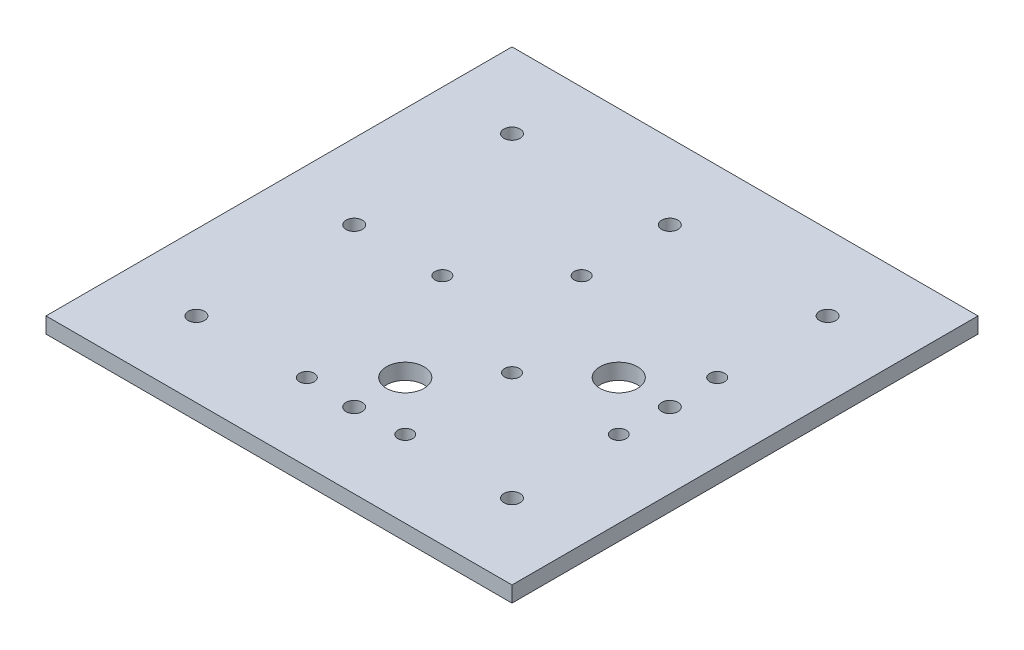
ISO-10303-21;
HEADER;
FILE_DESCRIPTION(('STEP AP214'),'2;1');
FILE_NAME('part.step','',(''),(''),'','','');
FILE_SCHEMA(('AUTOMOTIVE_DESIGN { 1 0 10303 214 1 1 1 1 }'));
ENDSEC;
DATA;
#1=APPLICATION_CONTEXT('core data for automotive mechanical design processes');
#2=APPLICATION_PROTOCOL_DEFINITION('international standard','automotive_design',2000,#1);
#3=PRODUCT_CONTEXT('',#1,'mechanical');
#4=PRODUCT('Part','Part','',(#3));
#5=PRODUCT_RELATED_PRODUCT_CATEGORY('part','',(#4));
#6=PRODUCT_DEFINITION_FORMATION('','',#4);
#7=PRODUCT_DEFINITION_CONTEXT('part definition',#1,'design');
#8=PRODUCT_DEFINITION('design','',#6,#7);
#9=PRODUCT_DEFINITION_SHAPE('','',#8);
#10=(LENGTH_UNIT() NAMED_UNIT(*) SI_UNIT(.MILLI.,.METRE.));
#11=(NAMED_UNIT(*) PLANE_ANGLE_UNIT() SI_UNIT($,.RADIAN.));
#12=(NAMED_UNIT(*) SI_UNIT($,.STERADIAN.) SOLID_ANGLE_UNIT());
#13=UNCERTAINTY_MEASURE_WITH_UNIT(LENGTH_MEASURE(1.E-05),#10,'distance_accuracy_value','');
#14=(GEOMETRIC_REPRESENTATION_CONTEXT(3) GLOBAL_UNCERTAINTY_ASSIGNED_CONTEXT((#13)) GLOBAL_UNIT_ASSIGNED_CONTEXT((#10,
#11,#12)) REPRESENTATION_CONTEXT('',''));
#15=CARTESIAN_POINT('',(0.,0.,0.));
#16=DIRECTION('',(0.,0.,1.));
#17=DIRECTION('',(1.,0.,0.));
#18=AXIS2_PLACEMENT_3D('',#15,#16,#17);
#19=CARTESIAN_POINT('',(0.,-3.4,0.));
#20=DIRECTION('',(0.,-1.,0.));
#21=DIRECTION('',(0.,0.,-1.));
#22=AXIS2_PLACEMENT_3D('',#19,#20,#21);
#23=PLANE('',#22);
#24=CARTESIAN_POINT('',(49.,-3.4,-26.));
#25=DIRECTION('',(0.,-1.,0.));
#26=DIRECTION('',(0.,0.,-1.));
#27=AXIS2_PLACEMENT_3D('',#24,#25,#26);
#28=CIRCLE('',#27,4.05);
#29=CARTESIAN_POINT('',(49.,-3.4,-30.05));
#30=VERTEX_POINT('',#29);
#31=EDGE_CURVE('E149',#30,#30,#28,.T.);
#32=ORIENTED_EDGE('',*,*,#31,.F.);
#33=EDGE_LOOP('',(#32));
#34=FACE_BOUND('',#33,.T.);
#35=CARTESIAN_POINT('',(38.3933982822018,-3.4,-15.3933982822018));
#36=DIRECTION('',(0.,-1.,0.));
#37=DIRECTION('',(0.,0.,-1.));
#38=AXIS2_PLACEMENT_3D('',#35,#36,#37);
#39=CIRCLE('',#38,1.6);
#40=CARTESIAN_POINT('',(38.3933982822018,-3.4,-16.9933982822018));
#41=VERTEX_POINT('',#40);
#42=EDGE_CURVE('E137',#41,#41,#39,.T.);
#43=ORIENTED_EDGE('',*,*,#42,.F.);
#44=EDGE_LOOP('',(#43));
#45=FACE_BOUND('',#44,.T.);
#46=CARTESIAN_POINT('',(59.6066017177982,-3.4,-15.3933982822018));
#47=DIRECTION('',(0.,-1.,0.));
#48=DIRECTION('',(0.,0.,-1.));
#49=AXIS2_PLACEMENT_3D('',#46,#47,#48);
#50=CIRCLE('',#49,1.6);
#51=CARTESIAN_POINT('',(59.6066017177982,-3.4,-16.9933982822018));
#52=VERTEX_POINT('',#51);
#53=EDGE_CURVE('E134',#52,#52,#50,.T.);
#54=ORIENTED_EDGE('',*,*,#53,.F.);
#55=EDGE_LOOP('',(#54));
#56=FACE_BOUND('',#55,.T.);
#57=CARTESIAN_POINT('',(34.,-3.4,-49.));
#58=DIRECTION('',(0.,-1.,0.));
#59=DIRECTION('',(0.,0.,-1.));
#60=AXIS2_PLACEMENT_3D('',#57,#58,#59);
#61=CIRCLE('',#60,1.6);
#62=CARTESIAN_POINT('',(34.,-3.4,-50.6));
#63=VERTEX_POINT('',#62);
#64=EDGE_CURVE('E131',#63,#63,#61,.T.);
#65=ORIENTED_EDGE('',*,*,#64,.F.);
#66=EDGE_LOOP('',(#65));
#67=FACE_BOUND('',#66,.T.);
#68=CARTESIAN_POINT('',(72.,-3.4,-49.));
#69=DIRECTION('',(0.,-1.,0.));
#70=DIRECTION('',(0.,0.,-1.));
#71=AXIS2_PLACEMENT_3D('',#68,#69,#70);
#72=CIRCLE('',#71,4.04999999999999);
#73=CARTESIAN_POINT('',(72.,-3.4,-53.05));
#74=VERTEX_POINT('',#73);
#75=EDGE_CURVE('E127',#74,#74,#72,.T.);
#76=ORIENTED_EDGE('',*,*,#75,.F.);
#77=EDGE_LOOP('',(#76));
#78=FACE_BOUND('',#77,.T.);
#79=CARTESIAN_POINT('',(49.,-3.4,-64.));
#80=DIRECTION('',(0.,-1.,0.));
#81=DIRECTION('',(0.,0.,-1.));
#82=AXIS2_PLACEMENT_3D('',#79,#80,#81);
#83=CIRCLE('',#82,1.59999999999998);
#84=CARTESIAN_POINT('',(49.,-3.4,-65.6));
#85=VERTEX_POINT('',#84);
#86=EDGE_CURVE('E123',#85,#85,#83,.T.);
#87=ORIENTED_EDGE('',*,*,#86,.F.);
#88=EDGE_LOOP('',(#87));
#89=FACE_BOUND('',#88,.T.);
#90=CARTESIAN_POINT('',(82.6066017177982,-3.4,-59.6066017177982));
#91=DIRECTION('',(0.,-1.,0.));
#92=DIRECTION('',(0.,0.,-1.));
#93=AXIS2_PLACEMENT_3D('',#90,#91,#92);
#94=CIRCLE('',#93,1.6);
#95=CARTESIAN_POINT('',(82.6066017177982,-3.4,-61.2066017177982));
#96=VERTEX_POINT('',#95);
#97=EDGE_CURVE('E119',#96,#96,#94,.T.);
#98=ORIENTED_EDGE('',*,*,#97,.F.);
#99=EDGE_LOOP('',(#98));
#100=FACE_BOUND('',#99,.T.);
#101=CARTESIAN_POINT('',(82.6066017177982,-3.4,-38.3933982822018));
#102=DIRECTION('',(0.,-1.,0.));
#103=DIRECTION('',(0.,0.,-1.));
#104=AXIS2_PLACEMENT_3D('',#101,#102,#103);
#105=CIRCLE('',#104,1.60000000000001);
#106=CARTESIAN_POINT('',(82.6066017177982,-3.4,-39.9933982822018));
#107=VERTEX_POINT('',#106);
#108=EDGE_CURVE('E115',#107,#107,#105,.T.);
#109=ORIENTED_EDGE('',*,*,#108,.F.);
#110=EDGE_LOOP('',(#109));
#111=FACE_BOUND('',#110,.T.);
#112=CARTESIAN_POINT('',(59.6066017177982,-3.4,-38.3933982822018));
#113=DIRECTION('',(0.,-1.,0.));
#114=DIRECTION('',(0.,0.,-1.));
#115=AXIS2_PLACEMENT_3D('',#112,#113,#114);
#116=CIRCLE('',#115,1.6);
#117=CARTESIAN_POINT('',(59.6066017177982,-3.4,-39.9933982822018));
#118=VERTEX_POINT('',#117);
#119=EDGE_CURVE('E111',#118,#118,#116,.T.);
#120=ORIENTED_EDGE('',*,*,#119,.F.);
#121=EDGE_LOOP('',(#120));
#122=FACE_BOUND('',#121,.T.);
#123=CARTESIAN_POINT('',(83.0000000000007,-3.4,-15.));
#124=DIRECTION('',(0.,-1.,0.));
#125=DIRECTION('',(0.,0.,-1.));
#126=AXIS2_PLACEMENT_3D('',#123,#124,#125);
#127=CIRCLE('',#126,1.75);
#128=CARTESIAN_POINT('',(83.0000000000007,-3.4,-16.75));
#129=VERTEX_POINT('',#128);
#130=EDGE_CURVE('E159',#129,#129,#127,.T.);
#131=ORIENTED_EDGE('',*,*,#130,.F.);
#132=EDGE_LOOP('',(#131));
#133=FACE_BOUND('',#132,.T.);
#134=CARTESIAN_POINT('',(83.,-3.4,-83.));
#135=DIRECTION('',(0.,-1.,0.));
#136=DIRECTION('',(0.,0.,-1.));
#137=AXIS2_PLACEMENT_3D('',#134,#135,#136);
#138=CIRCLE('',#137,1.75);
#139=CARTESIAN_POINT('',(83.,-3.4,-84.75));
#140=VERTEX_POINT('',#139);
#141=EDGE_CURVE('E171',#140,#140,#138,.T.);
#142=ORIENTED_EDGE('',*,*,#141,.F.);
#143=EDGE_LOOP('',(#142));
#144=FACE_BOUND('',#143,.T.);
#145=CARTESIAN_POINT('',(15.,-3.4,-83.));
#146=DIRECTION('',(0.,-1.,0.));
#147=DIRECTION('',(0.,0.,-1.));
#148=AXIS2_PLACEMENT_3D('',#145,#146,#147);
#149=CIRCLE('',#148,1.75);
#150=CARTESIAN_POINT('',(15.,-3.4,-84.75));
#151=VERTEX_POINT('',#150);
#152=EDGE_CURVE('E183',#151,#151,#149,.T.);
#153=ORIENTED_EDGE('',*,*,#152,.F.);
#154=EDGE_LOOP('',(#153));
#155=FACE_BOUND('',#154,.T.);
#156=CARTESIAN_POINT('',(15.0000000000007,-3.4,-15.));
#157=DIRECTION('',(0.,-1.,0.));
#158=DIRECTION('',(0.,0.,-1.));
#159=AXIS2_PLACEMENT_3D('',#156,#157,#158);
#160=CIRCLE('',#159,1.75);
#161=CARTESIAN_POINT('',(15.0000000000007,-3.4,-16.75));
#162=VERTEX_POINT('',#161);
#163=EDGE_CURVE('E102',#162,#162,#160,.T.);
#164=ORIENTED_EDGE('',*,*,#163,.F.);
#165=EDGE_LOOP('',(#164));
#166=FACE_BOUND('',#165,.T.);
#167=DIRECTION('',(-1.,0.,0.));
#168=VECTOR('',#167,1.);
#169=CARTESIAN_POINT('',(99.2,-3.4,1.2));
#170=LINE('',#169,#168);
#171=CARTESIAN_POINT('',(99.2,-3.4,1.2));
#172=VERTEX_POINT('',#171);
#173=CARTESIAN_POINT('',(-1.2,-3.4,1.2));
#174=VERTEX_POINT('',#173);
#175=EDGE_CURVE('E86',#172,#174,#170,.T.);
#176=ORIENTED_EDGE('',*,*,#175,.T.);
#177=DIRECTION('',(0.,0.,-1.));
#178=VECTOR('',#177,1.);
#179=CARTESIAN_POINT('',(-1.2,-3.4,1.2));
#180=LINE('',#179,#178);
#181=CARTESIAN_POINT('',(-1.20000000000003,-3.4,-99.2));
#182=VERTEX_POINT('',#181);
#183=EDGE_CURVE('E81',#174,#182,#180,.T.);
#184=ORIENTED_EDGE('',*,*,#183,.T.);
#185=DIRECTION('',(1.,0.,0.));
#186=VECTOR('',#185,1.);
#187=CARTESIAN_POINT('',(-1.20000000000003,-3.4,-99.2));
#188=LINE('',#187,#186);
#189=CARTESIAN_POINT('',(99.2,-3.4,-99.2));
#190=VERTEX_POINT('',#189);
#191=EDGE_CURVE('E84',#182,#190,#188,.T.);
#192=ORIENTED_EDGE('',*,*,#191,.T.);
#193=DIRECTION('',(0.,0.,1.));
#194=VECTOR('',#193,1.);
#195=CARTESIAN_POINT('',(99.2,-3.4,-99.2));
#196=LINE('',#195,#194);
#197=EDGE_CURVE('E51',#190,#172,#196,.T.);
#198=ORIENTED_EDGE('',*,*,#197,.T.);
#199=EDGE_LOOP('',(#176,#184,#192,#198));
#200=FACE_BOUND('',#199,.T.);
#201=CARTESIAN_POINT('',(15.0000000000004,-3.4,-49.));
#202=DIRECTION('',(0.,-1.,0.));
#203=DIRECTION('',(0.,0.,-1.));
#204=AXIS2_PLACEMENT_3D('',#201,#202,#203);
#205=CIRCLE('',#204,1.75);
#206=CARTESIAN_POINT('',(15.0000000000004,-3.4,-50.75));
#207=VERTEX_POINT('',#206);
#208=EDGE_CURVE('E189',#207,#207,#205,.T.);
#209=ORIENTED_EDGE('',*,*,#208,.F.);
#210=EDGE_LOOP('',(#209));
#211=FACE_BOUND('',#210,.T.);
#212=CARTESIAN_POINT('',(49.,-3.4,-83.));
#213=DIRECTION('',(0.,-1.,0.));
#214=DIRECTION('',(0.,0.,-1.));
#215=AXIS2_PLACEMENT_3D('',#212,#213,#214);
#216=CIRCLE('',#215,1.75);
#217=CARTESIAN_POINT('',(49.,-3.4,-84.75));
#218=VERTEX_POINT('',#217);
#219=EDGE_CURVE('E177',#218,#218,#216,.T.);
#220=ORIENTED_EDGE('',*,*,#219,.F.);
#221=EDGE_LOOP('',(#220));
#222=FACE_BOUND('',#221,.T.);
#223=CARTESIAN_POINT('',(83.0000000000004,-3.4,-49.));
#224=DIRECTION('',(0.,-1.,0.));
#225=DIRECTION('',(0.,0.,-1.));
#226=AXIS2_PLACEMENT_3D('',#223,#224,#225);
#227=CIRCLE('',#226,1.75);
#228=CARTESIAN_POINT('',(83.0000000000004,-3.4,-50.75));
#229=VERTEX_POINT('',#228);
#230=EDGE_CURVE('E165',#229,#229,#227,.T.);
#231=ORIENTED_EDGE('',*,*,#230,.F.);
#232=EDGE_LOOP('',(#231));
#233=FACE_BOUND('',#232,.T.);
#234=CARTESIAN_POINT('',(49.0000000000007,-3.4,-15.));
#235=DIRECTION('',(0.,-1.,0.));
#236=DIRECTION('',(0.,0.,-1.));
#237=AXIS2_PLACEMENT_3D('',#234,#235,#236);
#238=CIRCLE('',#237,1.75);
#239=CARTESIAN_POINT('',(49.0000000000007,-3.4,-16.75));
#240=VERTEX_POINT('',#239);
#241=EDGE_CURVE('E153',#240,#240,#238,.T.);
#242=ORIENTED_EDGE('',*,*,#241,.F.);
#243=EDGE_LOOP('',(#242));
#244=FACE_BOUND('',#243,.T.);
#245=ADVANCED_FACE('F32',(#34,#45,#56,#67,#78,#89,#100,#111,#122,#133,#144,#155,#166,#200,#211,
#222,#233,#244),#23,.T.);
#246=CARTESIAN_POINT('',(0.,0.,0.));
#247=DIRECTION('',(0.,-1.,0.));
#248=DIRECTION('',(0.,0.,-1.));
#249=AXIS2_PLACEMENT_3D('',#246,#247,#248);
#250=PLANE('',#249);
#251=CARTESIAN_POINT('',(49.,0.,-26.));
#252=DIRECTION('',(0.,-1.,0.));
#253=DIRECTION('',(0.,0.,-1.));
#254=AXIS2_PLACEMENT_3D('',#251,#252,#253);
#255=CIRCLE('',#254,4.05);
#256=CARTESIAN_POINT('',(49.,0.,-30.05));
#257=VERTEX_POINT('',#256);
#258=EDGE_CURVE('E36',#257,#257,#255,.T.);
#259=ORIENTED_EDGE('',*,*,#258,.T.);
#260=EDGE_LOOP('',(#259));
#261=FACE_BOUND('',#260,.T.);
#262=CARTESIAN_POINT('',(38.3933982822018,0.,-15.3933982822018));
#263=DIRECTION('',(0.,-1.,0.));
#264=DIRECTION('',(0.,0.,-1.));
#265=AXIS2_PLACEMENT_3D('',#262,#263,#264);
#266=CIRCLE('',#265,1.6);
#267=CARTESIAN_POINT('',(38.3933982822018,0.,-16.9933982822018));
#268=VERTEX_POINT('',#267);
#269=EDGE_CURVE('E135',#268,#268,#266,.T.);
#270=ORIENTED_EDGE('',*,*,#269,.T.);
#271=EDGE_LOOP('',(#270));
#272=FACE_BOUND('',#271,.T.);
#273=CARTESIAN_POINT('',(59.6066017177982,0.,-15.3933982822018));
#274=DIRECTION('',(0.,-1.,0.));
#275=DIRECTION('',(0.,0.,-1.));
#276=AXIS2_PLACEMENT_3D('',#273,#274,#275);
#277=CIRCLE('',#276,1.6);
#278=CARTESIAN_POINT('',(59.6066017177982,0.,-16.9933982822018));
#279=VERTEX_POINT('',#278);
#280=EDGE_CURVE('E132',#279,#279,#277,.T.);
#281=ORIENTED_EDGE('',*,*,#280,.T.);
#282=EDGE_LOOP('',(#281));
#283=FACE_BOUND('',#282,.T.);
#284=CARTESIAN_POINT('',(34.,0.,-49.));
#285=DIRECTION('',(0.,-1.,0.));
#286=DIRECTION('',(0.,0.,-1.));
#287=AXIS2_PLACEMENT_3D('',#284,#285,#286);
#288=CIRCLE('',#287,1.6);
#289=CARTESIAN_POINT('',(34.,0.,-50.6));
#290=VERTEX_POINT('',#289);
#291=EDGE_CURVE('E128',#290,#290,#288,.T.);
#292=ORIENTED_EDGE('',*,*,#291,.T.);
#293=EDGE_LOOP('',(#292));
#294=FACE_BOUND('',#293,.T.);
#295=CARTESIAN_POINT('',(72.,0.,-49.));
#296=DIRECTION('',(0.,-1.,0.));
#297=DIRECTION('',(0.,0.,-1.));
#298=AXIS2_PLACEMENT_3D('',#295,#296,#297);
#299=CIRCLE('',#298,4.04999999999999);
#300=CARTESIAN_POINT('',(72.,0.,-53.05));
#301=VERTEX_POINT('',#300);
#302=EDGE_CURVE('E124',#301,#301,#299,.T.);
#303=ORIENTED_EDGE('',*,*,#302,.T.);
#304=EDGE_LOOP('',(#303));
#305=FACE_BOUND('',#304,.T.);
#306=CARTESIAN_POINT('',(49.,0.,-64.));
#307=DIRECTION('',(0.,-1.,0.));
#308=DIRECTION('',(0.,0.,-1.));
#309=AXIS2_PLACEMENT_3D('',#306,#307,#308);
#310=CIRCLE('',#309,1.59999999999998);
#311=CARTESIAN_POINT('',(49.,0.,-65.6));
#312=VERTEX_POINT('',#311);
#313=EDGE_CURVE('E120',#312,#312,#310,.T.);
#314=ORIENTED_EDGE('',*,*,#313,.T.);
#315=EDGE_LOOP('',(#314));
#316=FACE_BOUND('',#315,.T.);
#317=CARTESIAN_POINT('',(82.6066017177982,0.,-59.6066017177982));
#318=DIRECTION('',(0.,-1.,0.));
#319=DIRECTION('',(0.,0.,-1.));
#320=AXIS2_PLACEMENT_3D('',#317,#318,#319);
#321=CIRCLE('',#320,1.6);
#322=CARTESIAN_POINT('',(82.6066017177982,0.,-61.2066017177982));
#323=VERTEX_POINT('',#322);
#324=EDGE_CURVE('E116',#323,#323,#321,.T.);
#325=ORIENTED_EDGE('',*,*,#324,.T.);
#326=EDGE_LOOP('',(#325));
#327=FACE_BOUND('',#326,.T.);
#328=CARTESIAN_POINT('',(82.6066017177982,0.,-38.3933982822018));
#329=DIRECTION('',(0.,-1.,0.));
#330=DIRECTION('',(0.,0.,-1.));
#331=AXIS2_PLACEMENT_3D('',#328,#329,#330);
#332=CIRCLE('',#331,1.60000000000001);
#333=CARTESIAN_POINT('',(82.6066017177982,0.,-39.9933982822018));
#334=VERTEX_POINT('',#333);
#335=EDGE_CURVE('E112',#334,#334,#332,.T.);
#336=ORIENTED_EDGE('',*,*,#335,.T.);
#337=EDGE_LOOP('',(#336));
#338=FACE_BOUND('',#337,.T.);
#339=CARTESIAN_POINT('',(59.6066017177982,0.,-38.3933982822018));
#340=DIRECTION('',(0.,-1.,0.));
#341=DIRECTION('',(0.,0.,-1.));
#342=AXIS2_PLACEMENT_3D('',#339,#340,#341);
#343=CIRCLE('',#342,1.6);
#344=CARTESIAN_POINT('',(59.6066017177982,0.,-39.9933982822018));
#345=VERTEX_POINT('',#344);
#346=EDGE_CURVE('E108',#345,#345,#343,.T.);
#347=ORIENTED_EDGE('',*,*,#346,.T.);
#348=EDGE_LOOP('',(#347));
#349=FACE_BOUND('',#348,.T.);
#350=CARTESIAN_POINT('',(83.0000000000007,0.,-15.));
#351=DIRECTION('',(0.,-1.,0.));
#352=DIRECTION('',(0.,0.,-1.));
#353=AXIS2_PLACEMENT_3D('',#350,#351,#352);
#354=CIRCLE('',#353,1.75);
#355=CARTESIAN_POINT('',(83.0000000000007,0.,-16.75));
#356=VERTEX_POINT('',#355);
#357=EDGE_CURVE('E156',#356,#356,#354,.T.);
#358=ORIENTED_EDGE('',*,*,#357,.T.);
#359=EDGE_LOOP('',(#358));
#360=FACE_BOUND('',#359,.T.);
#361=CARTESIAN_POINT('',(83.,0.,-83.));
#362=DIRECTION('',(0.,-1.,0.));
#363=DIRECTION('',(0.,0.,-1.));
#364=AXIS2_PLACEMENT_3D('',#361,#362,#363);
#365=CIRCLE('',#364,1.75);
#366=CARTESIAN_POINT('',(83.,0.,-84.75));
#367=VERTEX_POINT('',#366);
#368=EDGE_CURVE('E168',#367,#367,#365,.T.);
#369=ORIENTED_EDGE('',*,*,#368,.T.);
#370=EDGE_LOOP('',(#369));
#371=FACE_BOUND('',#370,.T.);
#372=CARTESIAN_POINT('',(15.,0.,-83.));
#373=DIRECTION('',(0.,-1.,0.));
#374=DIRECTION('',(0.,0.,-1.));
#375=AXIS2_PLACEMENT_3D('',#372,#373,#374);
#376=CIRCLE('',#375,1.75);
#377=CARTESIAN_POINT('',(15.,0.,-84.75));
#378=VERTEX_POINT('',#377);
#379=EDGE_CURVE('E180',#378,#378,#376,.T.);
#380=ORIENTED_EDGE('',*,*,#379,.T.);
#381=EDGE_LOOP('',(#380));
#382=FACE_BOUND('',#381,.T.);
#383=CARTESIAN_POINT('',(15.0000000000007,0.,-15.));
#384=DIRECTION('',(0.,-1.,0.));
#385=DIRECTION('',(0.,0.,-1.));
#386=AXIS2_PLACEMENT_3D('',#383,#384,#385);
#387=CIRCLE('',#386,1.75);
#388=CARTESIAN_POINT('',(15.0000000000007,0.,-16.75));
#389=VERTEX_POINT('',#388);
#390=EDGE_CURVE('E192',#389,#389,#387,.T.);
#391=ORIENTED_EDGE('',*,*,#390,.T.);
#392=EDGE_LOOP('',(#391));
#393=FACE_BOUND('',#392,.T.);
#394=DIRECTION('',(-1.,0.,0.));
#395=VECTOR('',#394,1.);
#396=CARTESIAN_POINT('',(99.2,0.,1.2));
#397=LINE('',#396,#395);
#398=CARTESIAN_POINT('',(99.2,0.,1.2));
#399=VERTEX_POINT('',#398);
#400=CARTESIAN_POINT('',(-1.2,0.,1.2));
#401=VERTEX_POINT('',#400);
#402=EDGE_CURVE('E99',#399,#401,#397,.T.);
#403=ORIENTED_EDGE('',*,*,#402,.F.);
#404=DIRECTION('',(0.,0.,1.));
#405=VECTOR('',#404,1.);
#406=CARTESIAN_POINT('',(99.2,0.,-99.2));
#407=LINE('',#406,#405);
#408=CARTESIAN_POINT('',(99.2,0.,-99.2));
#409=VERTEX_POINT('',#408);
#410=EDGE_CURVE('E74',#409,#399,#407,.T.);
#411=ORIENTED_EDGE('',*,*,#410,.F.);
#412=DIRECTION('',(1.,0.,0.));
#413=VECTOR('',#412,1.);
#414=CARTESIAN_POINT('',(-1.20000000000003,0.,-99.2));
#415=LINE('',#414,#413);
#416=CARTESIAN_POINT('',(-1.20000000000003,0.,-99.2));
#417=VERTEX_POINT('',#416);
#418=EDGE_CURVE('E68',#417,#409,#415,.T.);
#419=ORIENTED_EDGE('',*,*,#418,.F.);
#420=DIRECTION('',(0.,0.,-1.));
#421=VECTOR('',#420,1.);
#422=CARTESIAN_POINT('',(-1.2,0.,1.2));
#423=LINE('',#422,#421);
#424=EDGE_CURVE('E90',#401,#417,#423,.T.);
#425=ORIENTED_EDGE('',*,*,#424,.F.);
#426=EDGE_LOOP('',(#403,#411,#419,#425));
#427=FACE_BOUND('',#426,.T.);
#428=CARTESIAN_POINT('',(15.0000000000004,0.,-49.));
#429=DIRECTION('',(0.,-1.,0.));
#430=DIRECTION('',(0.,0.,-1.));
#431=AXIS2_PLACEMENT_3D('',#428,#429,#430);
#432=CIRCLE('',#431,1.75);
#433=CARTESIAN_POINT('',(15.0000000000004,0.,-50.75));
#434=VERTEX_POINT('',#433);
#435=EDGE_CURVE('E186',#434,#434,#432,.T.);
#436=ORIENTED_EDGE('',*,*,#435,.T.);
#437=EDGE_LOOP('',(#436));
#438=FACE_BOUND('',#437,.T.);
#439=CARTESIAN_POINT('',(49.,0.,-83.));
#440=DIRECTION('',(0.,-1.,0.));
#441=DIRECTION('',(0.,0.,-1.));
#442=AXIS2_PLACEMENT_3D('',#439,#440,#441);
#443=CIRCLE('',#442,1.75);
#444=CARTESIAN_POINT('',(49.,0.,-84.75));
#445=VERTEX_POINT('',#444);
#446=EDGE_CURVE('E174',#445,#445,#443,.T.);
#447=ORIENTED_EDGE('',*,*,#446,.T.);
#448=EDGE_LOOP('',(#447));
#449=FACE_BOUND('',#448,.T.);
#450=CARTESIAN_POINT('',(83.0000000000004,0.,-49.));
#451=DIRECTION('',(0.,-1.,0.));
#452=DIRECTION('',(0.,0.,-1.));
#453=AXIS2_PLACEMENT_3D('',#450,#451,#452);
#454=CIRCLE('',#453,1.75);
#455=CARTESIAN_POINT('',(83.0000000000004,0.,-50.75));
#456=VERTEX_POINT('',#455);
#457=EDGE_CURVE('E162',#456,#456,#454,.T.);
#458=ORIENTED_EDGE('',*,*,#457,.T.);
#459=EDGE_LOOP('',(#458));
#460=FACE_BOUND('',#459,.T.);
#461=CARTESIAN_POINT('',(49.0000000000007,0.,-15.));
#462=DIRECTION('',(0.,-1.,0.));
#463=DIRECTION('',(0.,0.,-1.));
#464=AXIS2_PLACEMENT_3D('',#461,#462,#463);
#465=CIRCLE('',#464,1.75);
#466=CARTESIAN_POINT('',(49.0000000000007,0.,-16.75));
#467=VERTEX_POINT('',#466);
#468=EDGE_CURVE('E152',#467,#467,#465,.T.);
#469=ORIENTED_EDGE('',*,*,#468,.T.);
#470=EDGE_LOOP('',(#469));
#471=FACE_BOUND('',#470,.T.);
#472=ADVANCED_FACE('F200',(#261,#272,#283,#294,#305,#316,#327,#338,#349,#360,#371,#382,#393,
#427,#438,#449,#460,#471),#250,.F.);
#473=CARTESIAN_POINT('',(99.2,-3.4,1.2));
#474=DIRECTION('',(0.,0.,-1.));
#475=DIRECTION('',(-1.,0.,0.));
#476=AXIS2_PLACEMENT_3D('',#473,#474,#475);
#477=PLANE('',#476);
#478=ORIENTED_EDGE('',*,*,#402,.T.);
#479=DIRECTION('',(0.,1.,0.));
#480=VECTOR('',#479,1.);
#481=CARTESIAN_POINT('',(-1.2,-3.4,1.2));
#482=LINE('',#481,#480);
#483=EDGE_CURVE('E11',#174,#401,#482,.T.);
#484=ORIENTED_EDGE('',*,*,#483,.F.);
#485=ORIENTED_EDGE('',*,*,#175,.F.);
#486=DIRECTION('',(0.,1.,0.));
#487=VECTOR('',#486,1.);
#488=CARTESIAN_POINT('',(99.2,-3.4,1.2));
#489=LINE('',#488,#487);
#490=EDGE_CURVE('E95',#172,#399,#489,.T.);
#491=ORIENTED_EDGE('',*,*,#490,.T.);
#492=EDGE_LOOP('',(#478,#484,#485,#491));
#493=FACE_BOUND('',#492,.T.);
#494=ADVANCED_FACE('F34',(#493),#477,.F.);
#495=CARTESIAN_POINT('',(-1.2,-3.4,1.2));
#496=DIRECTION('',(1.,0.,0.));
#497=DIRECTION('',(0.,0.,-1.));
#498=AXIS2_PLACEMENT_3D('',#495,#496,#497);
#499=PLANE('',#498);
#500=ORIENTED_EDGE('',*,*,#424,.T.);
#501=DIRECTION('',(0.,1.,0.));
#502=VECTOR('',#501,1.);
#503=CARTESIAN_POINT('',(-1.20000000000003,-3.4,-99.2));
#504=LINE('',#503,#502);
#505=EDGE_CURVE('E42',#182,#417,#504,.T.);
#506=ORIENTED_EDGE('',*,*,#505,.F.);
#507=ORIENTED_EDGE('',*,*,#183,.F.);
#508=ORIENTED_EDGE('',*,*,#483,.T.);
#509=EDGE_LOOP('',(#500,#506,#507,#508));
#510=FACE_BOUND('',#509,.T.);
#511=ADVANCED_FACE('F89',(#510),#499,.F.);
#512=CARTESIAN_POINT('',(-1.20000000000003,-3.4,-99.2));
#513=DIRECTION('',(0.,0.,1.));
#514=DIRECTION('',(1.,0.,0.));
#515=AXIS2_PLACEMENT_3D('',#512,#513,#514);
#516=PLANE('',#515);
#517=ORIENTED_EDGE('',*,*,#418,.T.);
#518=DIRECTION('',(0.,1.,0.));
#519=VECTOR('',#518,1.);
#520=CARTESIAN_POINT('',(99.2,-3.4,-99.2));
#521=LINE('',#520,#519);
#522=EDGE_CURVE('E91',#190,#409,#521,.T.);
#523=ORIENTED_EDGE('',*,*,#522,.F.);
#524=ORIENTED_EDGE('',*,*,#191,.F.);
#525=ORIENTED_EDGE('',*,*,#505,.T.);
#526=EDGE_LOOP('',(#517,#523,#524,#525));
#527=FACE_BOUND('',#526,.T.);
#528=ADVANCED_FACE('F93',(#527),#516,.F.);
#529=CARTESIAN_POINT('',(99.2,-3.4,-99.2));
#530=DIRECTION('',(-1.,0.,0.));
#531=DIRECTION('',(0.,0.,1.));
#532=AXIS2_PLACEMENT_3D('',#529,#530,#531);
#533=PLANE('',#532);
#534=ORIENTED_EDGE('',*,*,#410,.T.);
#535=ORIENTED_EDGE('',*,*,#490,.F.);
#536=ORIENTED_EDGE('',*,*,#197,.F.);
#537=ORIENTED_EDGE('',*,*,#522,.T.);
#538=EDGE_LOOP('',(#534,#535,#536,#537));
#539=FACE_BOUND('',#538,.T.);
#540=ADVANCED_FACE('F206',(#539),#533,.F.);
#541=CARTESIAN_POINT('',(15.0000000000007,-3.4,-15.));
#542=DIRECTION('',(0.,1.,0.));
#543=DIRECTION('',(0.,0.,1.));
#544=AXIS2_PLACEMENT_3D('',#541,#542,#543);
#545=CYLINDRICAL_SURFACE('',#544,1.75);
#546=ORIENTED_EDGE('',*,*,#163,.T.);
#547=EDGE_LOOP('',(#546));
#548=FACE_BOUND('',#547,.T.);
#549=ORIENTED_EDGE('',*,*,#390,.F.);
#550=EDGE_LOOP('',(#549));
#551=FACE_BOUND('',#550,.T.);
#552=ADVANCED_FACE('F203',(#548,#551),#545,.F.);
#553=CARTESIAN_POINT('',(15.0000000000004,-3.4,-49.));
#554=DIRECTION('',(0.,1.,0.));
#555=DIRECTION('',(0.,0.,1.));
#556=AXIS2_PLACEMENT_3D('',#553,#554,#555);
#557=CYLINDRICAL_SURFACE('',#556,1.75);
#558=ORIENTED_EDGE('',*,*,#208,.T.);
#559=EDGE_LOOP('',(#558));
#560=FACE_BOUND('',#559,.T.);
#561=ORIENTED_EDGE('',*,*,#435,.F.);
#562=EDGE_LOOP('',(#561));
#563=FACE_BOUND('',#562,.T.);
#564=ADVANCED_FACE('F205',(#560,#563),#557,.F.);
#565=CARTESIAN_POINT('',(15.,-3.4,-83.));
#566=DIRECTION('',(0.,1.,0.));
#567=DIRECTION('',(0.,0.,1.));
#568=AXIS2_PLACEMENT_3D('',#565,#566,#567);
#569=CYLINDRICAL_SURFACE('',#568,1.75);
#570=ORIENTED_EDGE('',*,*,#152,.T.);
#571=EDGE_LOOP('',(#570));
#572=FACE_BOUND('',#571,.T.);
#573=ORIENTED_EDGE('',*,*,#379,.F.);
#574=EDGE_LOOP('',(#573));
#575=FACE_BOUND('',#574,.T.);
#576=ADVANCED_FACE('F213',(#572,#575),#569,.F.);
#577=CARTESIAN_POINT('',(49.,-3.4,-83.));
#578=DIRECTION('',(0.,1.,0.));
#579=DIRECTION('',(0.,0.,1.));
#580=AXIS2_PLACEMENT_3D('',#577,#578,#579);
#581=CYLINDRICAL_SURFACE('',#580,1.75);
#582=ORIENTED_EDGE('',*,*,#219,.T.);
#583=EDGE_LOOP('',(#582));
#584=FACE_BOUND('',#583,.T.);
#585=ORIENTED_EDGE('',*,*,#446,.F.);
#586=EDGE_LOOP('',(#585));
#587=FACE_BOUND('',#586,.T.);
#588=ADVANCED_FACE('F270',(#584,#587),#581,.F.);
#589=CARTESIAN_POINT('',(83.,-3.4,-83.));
#590=DIRECTION('',(0.,1.,0.));
#591=DIRECTION('',(0.,0.,1.));
#592=AXIS2_PLACEMENT_3D('',#589,#590,#591);
#593=CYLINDRICAL_SURFACE('',#592,1.75);
#594=ORIENTED_EDGE('',*,*,#141,.T.);
#595=EDGE_LOOP('',(#594));
#596=FACE_BOUND('',#595,.T.);
#597=ORIENTED_EDGE('',*,*,#368,.F.);
#598=EDGE_LOOP('',(#597));
#599=FACE_BOUND('',#598,.T.);
#600=ADVANCED_FACE('F266',(#596,#599),#593,.F.);
#601=CARTESIAN_POINT('',(83.0000000000004,-3.4,-49.));
#602=DIRECTION('',(0.,1.,0.));
#603=DIRECTION('',(0.,0.,1.));
#604=AXIS2_PLACEMENT_3D('',#601,#602,#603);
#605=CYLINDRICAL_SURFACE('',#604,1.75);
#606=ORIENTED_EDGE('',*,*,#230,.T.);
#607=EDGE_LOOP('',(#606));
#608=FACE_BOUND('',#607,.T.);
#609=ORIENTED_EDGE('',*,*,#457,.F.);
#610=EDGE_LOOP('',(#609));
#611=FACE_BOUND('',#610,.T.);
#612=ADVANCED_FACE('F259',(#608,#611),#605,.F.);
#613=CARTESIAN_POINT('',(83.0000000000007,-3.4,-15.));
#614=DIRECTION('',(0.,1.,0.));
#615=DIRECTION('',(0.,0.,1.));
#616=AXIS2_PLACEMENT_3D('',#613,#614,#615);
#617=CYLINDRICAL_SURFACE('',#616,1.75);
#618=ORIENTED_EDGE('',*,*,#130,.T.);
#619=EDGE_LOOP('',(#618));
#620=FACE_BOUND('',#619,.T.);
#621=ORIENTED_EDGE('',*,*,#357,.F.);
#622=EDGE_LOOP('',(#621));
#623=FACE_BOUND('',#622,.T.);
#624=ADVANCED_FACE('F249',(#620,#623),#617,.F.);
#625=CARTESIAN_POINT('',(49.0000000000007,-3.4,-15.));
#626=DIRECTION('',(0.,1.,0.));
#627=DIRECTION('',(0.,0.,1.));
#628=AXIS2_PLACEMENT_3D('',#625,#626,#627);
#629=CYLINDRICAL_SURFACE('',#628,1.75);
#630=ORIENTED_EDGE('',*,*,#241,.T.);
#631=EDGE_LOOP('',(#630));
#632=FACE_BOUND('',#631,.T.);
#633=ORIENTED_EDGE('',*,*,#468,.F.);
#634=EDGE_LOOP('',(#633));
#635=FACE_BOUND('',#634,.T.);
#636=ADVANCED_FACE('F246',(#632,#635),#629,.F.);
#637=CARTESIAN_POINT('',(59.6066017177982,5.6,-38.3933982822018));
#638=DIRECTION('',(0.,-1.,0.));
#639=DIRECTION('',(0.,0.,-1.));
#640=AXIS2_PLACEMENT_3D('',#637,#638,#639);
#641=CYLINDRICAL_SURFACE('',#640,1.6);
#642=ORIENTED_EDGE('',*,*,#119,.T.);
#643=EDGE_LOOP('',(#642));
#644=FACE_BOUND('',#643,.T.);
#645=ORIENTED_EDGE('',*,*,#346,.F.);
#646=EDGE_LOOP('',(#645));
#647=FACE_BOUND('',#646,.T.);
#648=ADVANCED_FACE('F248',(#644,#647),#641,.F.);
#649=CARTESIAN_POINT('',(82.6066017177982,5.6,-38.3933982822018));
#650=DIRECTION('',(0.,-1.,0.));
#651=DIRECTION('',(0.,0.,-1.));
#652=AXIS2_PLACEMENT_3D('',#649,#650,#651);
#653=CYLINDRICAL_SURFACE('',#652,1.60000000000001);
#654=ORIENTED_EDGE('',*,*,#108,.T.);
#655=EDGE_LOOP('',(#654));
#656=FACE_BOUND('',#655,.T.);
#657=ORIENTED_EDGE('',*,*,#335,.F.);
#658=EDGE_LOOP('',(#657));
#659=FACE_BOUND('',#658,.T.);
#660=ADVANCED_FACE('F256',(#656,#659),#653,.F.);
#661=CARTESIAN_POINT('',(82.6066017177982,5.6,-59.6066017177982));
#662=DIRECTION('',(0.,-1.,0.));
#663=DIRECTION('',(0.,0.,-1.));
#664=AXIS2_PLACEMENT_3D('',#661,#662,#663);
#665=CYLINDRICAL_SURFACE('',#664,1.6);
#666=ORIENTED_EDGE('',*,*,#97,.T.);
#667=EDGE_LOOP('',(#666));
#668=FACE_BOUND('',#667,.T.);
#669=ORIENTED_EDGE('',*,*,#324,.F.);
#670=EDGE_LOOP('',(#669));
#671=FACE_BOUND('',#670,.T.);
#672=ADVANCED_FACE('F329',(#668,#671),#665,.F.);
#673=CARTESIAN_POINT('',(49.,5.6,-64.));
#674=DIRECTION('',(0.,-1.,0.));
#675=DIRECTION('',(0.,0.,-1.));
#676=AXIS2_PLACEMENT_3D('',#673,#674,#675);
#677=CYLINDRICAL_SURFACE('',#676,1.59999999999998);
#678=ORIENTED_EDGE('',*,*,#86,.T.);
#679=EDGE_LOOP('',(#678));
#680=FACE_BOUND('',#679,.T.);
#681=ORIENTED_EDGE('',*,*,#313,.F.);
#682=EDGE_LOOP('',(#681));
#683=FACE_BOUND('',#682,.T.);
#684=ADVANCED_FACE('F338',(#680,#683),#677,.F.);
#685=CARTESIAN_POINT('',(72.,5.6,-49.));
#686=DIRECTION('',(0.,-1.,0.));
#687=DIRECTION('',(0.,0.,-1.));
#688=AXIS2_PLACEMENT_3D('',#685,#686,#687);
#689=CYLINDRICAL_SURFACE('',#688,4.04999999999999);
#690=ORIENTED_EDGE('',*,*,#75,.T.);
#691=EDGE_LOOP('',(#690));
#692=FACE_BOUND('',#691,.T.);
#693=ORIENTED_EDGE('',*,*,#302,.F.);
#694=EDGE_LOOP('',(#693));
#695=FACE_BOUND('',#694,.T.);
#696=ADVANCED_FACE('F348',(#692,#695),#689,.F.);
#697=CARTESIAN_POINT('',(34.,5.6,-49.));
#698=DIRECTION('',(0.,-1.,0.));
#699=DIRECTION('',(0.,0.,-1.));
#700=AXIS2_PLACEMENT_3D('',#697,#698,#699);
#701=CYLINDRICAL_SURFACE('',#700,1.6);
#702=ORIENTED_EDGE('',*,*,#64,.T.);
#703=EDGE_LOOP('',(#702));
#704=FACE_BOUND('',#703,.T.);
#705=ORIENTED_EDGE('',*,*,#291,.F.);
#706=EDGE_LOOP('',(#705));
#707=FACE_BOUND('',#706,.T.);
#708=ADVANCED_FACE('F358',(#704,#707),#701,.F.);
#709=CARTESIAN_POINT('',(59.6066017177982,5.6,-15.3933982822018));
#710=DIRECTION('',(0.,-1.,0.));
#711=DIRECTION('',(0.,0.,-1.));
#712=AXIS2_PLACEMENT_3D('',#709,#710,#711);
#713=CYLINDRICAL_SURFACE('',#712,1.6);
#714=ORIENTED_EDGE('',*,*,#53,.T.);
#715=EDGE_LOOP('',(#714));
#716=FACE_BOUND('',#715,.T.);
#717=ORIENTED_EDGE('',*,*,#280,.F.);
#718=EDGE_LOOP('',(#717));
#719=FACE_BOUND('',#718,.T.);
#720=ADVANCED_FACE('F368',(#716,#719),#713,.F.);
#721=CARTESIAN_POINT('',(38.3933982822018,5.6,-15.3933982822018));
#722=DIRECTION('',(0.,-1.,0.));
#723=DIRECTION('',(0.,0.,-1.));
#724=AXIS2_PLACEMENT_3D('',#721,#722,#723);
#725=CYLINDRICAL_SURFACE('',#724,1.6);
#726=ORIENTED_EDGE('',*,*,#42,.T.);
#727=EDGE_LOOP('',(#726));
#728=FACE_BOUND('',#727,.T.);
#729=ORIENTED_EDGE('',*,*,#269,.F.);
#730=EDGE_LOOP('',(#729));
#731=FACE_BOUND('',#730,.T.);
#732=ADVANCED_FACE('F378',(#728,#731),#725,.F.);
#733=CARTESIAN_POINT('',(49.,5.6,-26.));
#734=DIRECTION('',(0.,-1.,0.));
#735=DIRECTION('',(0.,0.,-1.));
#736=AXIS2_PLACEMENT_3D('',#733,#734,#735);
#737=CYLINDRICAL_SURFACE('',#736,4.05);
#738=ORIENTED_EDGE('',*,*,#31,.T.);
#739=EDGE_LOOP('',(#738));
#740=FACE_BOUND('',#739,.T.);
#741=ORIENTED_EDGE('',*,*,#258,.F.);
#742=EDGE_LOOP('',(#741));
#743=FACE_BOUND('',#742,.T.);
#744=ADVANCED_FACE('F387',(#740,#743),#737,.F.);
#745=CLOSED_SHELL('',(#245,#472,#494,#511,#528,#540,#552,#564,#576,#588,#600,#612,#624,#636,
#648,#660,#672,#684,#696,#708,#720,#732,#744));
#746=MANIFOLD_SOLID_BREP('B2',#745);
#747=ADVANCED_BREP_SHAPE_REPRESENTATION('',(#18,#746),#14);
#748=SHAPE_DEFINITION_REPRESENTATION(#9,#747);
ENDSEC;
END-ISO-10303-21;
